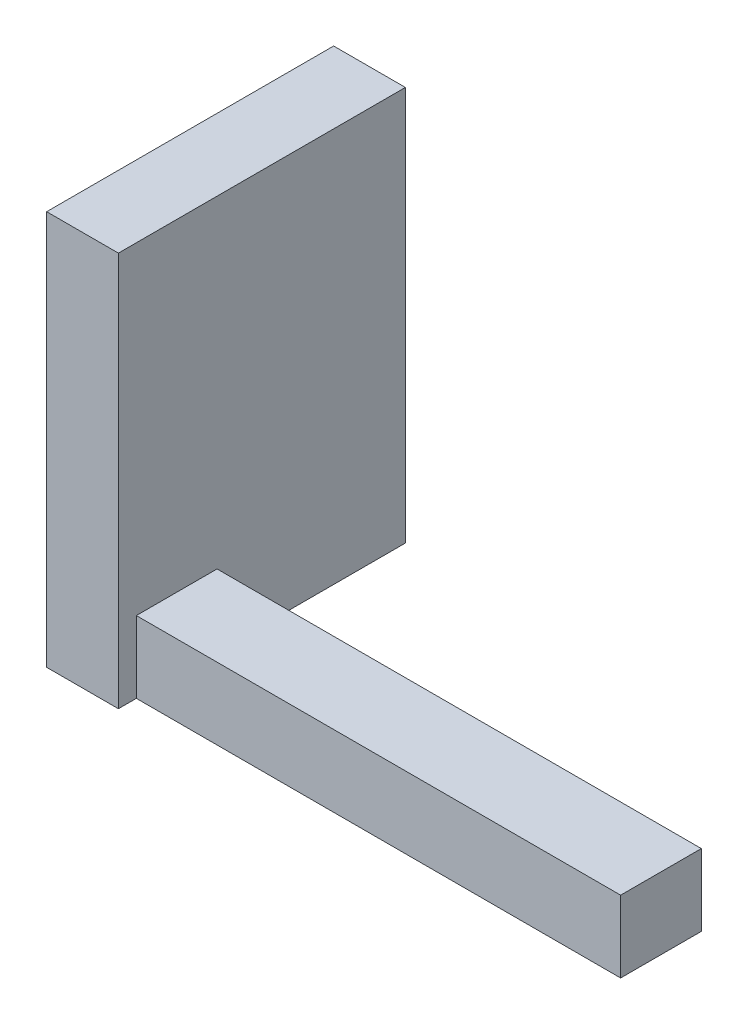
ISO-10303-21;
HEADER;
FILE_DESCRIPTION(('STEP AP214'),'2;1');
FILE_NAME('part.step','',(''),(''),'','','');
FILE_SCHEMA(('AUTOMOTIVE_DESIGN { 1 0 10303 214 1 1 1 1 }'));
ENDSEC;
DATA;
#1=APPLICATION_CONTEXT('core data for automotive mechanical design processes');
#2=APPLICATION_PROTOCOL_DEFINITION('international standard','automotive_design',2000,#1);
#3=PRODUCT_CONTEXT('',#1,'mechanical');
#4=PRODUCT('Part','Part','',(#3));
#5=PRODUCT_RELATED_PRODUCT_CATEGORY('part','',(#4));
#6=PRODUCT_DEFINITION_FORMATION('','',#4);
#7=PRODUCT_DEFINITION_CONTEXT('part definition',#1,'design');
#8=PRODUCT_DEFINITION('design','',#6,#7);
#9=PRODUCT_DEFINITION_SHAPE('','',#8);
#10=(LENGTH_UNIT() NAMED_UNIT(*) SI_UNIT(.MILLI.,.METRE.));
#11=(NAMED_UNIT(*) PLANE_ANGLE_UNIT() SI_UNIT($,.RADIAN.));
#12=(NAMED_UNIT(*) SI_UNIT($,.STERADIAN.) SOLID_ANGLE_UNIT());
#13=UNCERTAINTY_MEASURE_WITH_UNIT(LENGTH_MEASURE(1.E-05),#10,'distance_accuracy_value','');
#14=(GEOMETRIC_REPRESENTATION_CONTEXT(3) GLOBAL_UNCERTAINTY_ASSIGNED_CONTEXT((#13)) GLOBAL_UNIT_ASSIGNED_CONTEXT((#10,
#11,#12)) REPRESENTATION_CONTEXT('',''));
#15=CARTESIAN_POINT('',(0.,0.,0.));
#16=DIRECTION('',(0.,0.,1.));
#17=DIRECTION('',(1.,0.,0.));
#18=AXIS2_PLACEMENT_3D('',#15,#16,#17);
#19=CARTESIAN_POINT('',(77.,66.,39.));
#20=DIRECTION('',(0.,0.,-1.));
#21=DIRECTION('',(-1.,0.,0.));
#22=AXIS2_PLACEMENT_3D('',#19,#20,#21);
#23=PLANE('',#22);
#24=DIRECTION('',(0.,-1.,0.));
#25=VECTOR('',#24,1.);
#26=CARTESIAN_POINT('',(46.,66.,39.));
#27=LINE('',#26,#25);
#28=CARTESIAN_POINT('',(46.,70.,39.));
#29=VERTEX_POINT('',#28);
#30=CARTESIAN_POINT('',(46.,66.,39.));
#31=VERTEX_POINT('',#30);
#32=EDGE_CURVE('E112',#29,#31,#27,.T.);
#33=ORIENTED_EDGE('',*,*,#32,.T.);
#34=DIRECTION('',(-1.,0.,0.));
#35=VECTOR('',#34,1.);
#36=CARTESIAN_POINT('',(77.,66.,39.));
#37=LINE('',#36,#35);
#38=CARTESIAN_POINT('',(77.,66.,39.));
#39=VERTEX_POINT('',#38);
#40=EDGE_CURVE('E12',#39,#31,#37,.T.);
#41=ORIENTED_EDGE('',*,*,#40,.F.);
#42=DIRECTION('',(0.,-1.,0.));
#43=VECTOR('',#42,1.);
#44=CARTESIAN_POINT('',(77.,66.,39.));
#45=LINE('',#44,#43);
#46=CARTESIAN_POINT('',(77.,70.,39.));
#47=VERTEX_POINT('',#46);
#48=EDGE_CURVE('E100',#47,#39,#45,.T.);
#49=ORIENTED_EDGE('',*,*,#48,.F.);
#50=DIRECTION('',(-1.,0.,0.));
#51=VECTOR('',#50,1.);
#52=CARTESIAN_POINT('',(77.,70.,39.));
#53=LINE('',#52,#51);
#54=EDGE_CURVE('E108',#47,#29,#53,.T.);
#55=ORIENTED_EDGE('',*,*,#54,.T.);
#56=EDGE_LOOP('',(#33,#41,#49,#55));
#57=FACE_BOUND('',#56,.T.);
#58=ADVANCED_FACE('F49',(#57),#23,.F.);
#59=CARTESIAN_POINT('',(77.,66.,34.5));
#60=DIRECTION('',(0.,1.,0.));
#61=DIRECTION('',(0.,0.,1.));
#62=AXIS2_PLACEMENT_3D('',#59,#60,#61);
#63=PLANE('',#62);
#64=DIRECTION('',(0.,0.,-1.));
#65=VECTOR('',#64,1.);
#66=CARTESIAN_POINT('',(46.,66.,34.5));
#67=LINE('',#66,#65);
#68=CARTESIAN_POINT('',(46.,66.,34.5));
#69=VERTEX_POINT('',#68);
#70=EDGE_CURVE('E104',#31,#69,#67,.T.);
#71=ORIENTED_EDGE('',*,*,#70,.T.);
#72=DIRECTION('',(-1.,0.,0.));
#73=VECTOR('',#72,1.);
#74=CARTESIAN_POINT('',(77.,66.,34.5));
#75=LINE('',#74,#73);
#76=CARTESIAN_POINT('',(77.,66.,34.5));
#77=VERTEX_POINT('',#76);
#78=EDGE_CURVE('E57',#77,#69,#75,.T.);
#79=ORIENTED_EDGE('',*,*,#78,.F.);
#80=DIRECTION('',(0.,0.,-1.));
#81=VECTOR('',#80,1.);
#82=CARTESIAN_POINT('',(77.,66.,34.5));
#83=LINE('',#82,#81);
#84=EDGE_CURVE('E95',#39,#77,#83,.T.);
#85=ORIENTED_EDGE('',*,*,#84,.F.);
#86=ORIENTED_EDGE('',*,*,#40,.T.);
#87=EDGE_LOOP('',(#71,#79,#85,#86));
#88=FACE_BOUND('',#87,.T.);
#89=ADVANCED_FACE('F103',(#88),#63,.F.);
#90=CARTESIAN_POINT('',(77.,66.,34.5));
#91=DIRECTION('',(0.,0.,1.));
#92=DIRECTION('',(1.,0.,0.));
#93=AXIS2_PLACEMENT_3D('',#90,#91,#92);
#94=PLANE('',#93);
#95=DIRECTION('',(0.,1.,0.));
#96=VECTOR('',#95,1.);
#97=CARTESIAN_POINT('',(46.,66.,34.5));
#98=LINE('',#97,#96);
#99=CARTESIAN_POINT('',(46.,70.,34.5));
#100=VERTEX_POINT('',#99);
#101=EDGE_CURVE('E82',#69,#100,#98,.T.);
#102=ORIENTED_EDGE('',*,*,#101,.T.);
#103=DIRECTION('',(-1.,0.,0.));
#104=VECTOR('',#103,1.);
#105=CARTESIAN_POINT('',(77.,70.,34.5));
#106=LINE('',#105,#104);
#107=CARTESIAN_POINT('',(77.,70.,34.5));
#108=VERTEX_POINT('',#107);
#109=EDGE_CURVE('E105',#108,#100,#106,.T.);
#110=ORIENTED_EDGE('',*,*,#109,.F.);
#111=DIRECTION('',(0.,1.,0.));
#112=VECTOR('',#111,1.);
#113=CARTESIAN_POINT('',(77.,66.,34.5));
#114=LINE('',#113,#112);
#115=EDGE_CURVE('E98',#77,#108,#114,.T.);
#116=ORIENTED_EDGE('',*,*,#115,.F.);
#117=ORIENTED_EDGE('',*,*,#78,.T.);
#118=EDGE_LOOP('',(#102,#110,#116,#117));
#119=FACE_BOUND('',#118,.T.);
#120=ADVANCED_FACE('F106',(#119),#94,.F.);
#121=CARTESIAN_POINT('',(77.,70.,34.5));
#122=DIRECTION('',(0.,-1.,0.));
#123=DIRECTION('',(0.,0.,-1.));
#124=AXIS2_PLACEMENT_3D('',#121,#122,#123);
#125=PLANE('',#124);
#126=DIRECTION('',(0.,0.,1.));
#127=VECTOR('',#126,1.);
#128=CARTESIAN_POINT('',(46.,70.,34.5));
#129=LINE('',#128,#127);
#130=EDGE_CURVE('E88',#100,#29,#129,.T.);
#131=ORIENTED_EDGE('',*,*,#130,.T.);
#132=ORIENTED_EDGE('',*,*,#54,.F.);
#133=DIRECTION('',(0.,0.,1.));
#134=VECTOR('',#133,1.);
#135=CARTESIAN_POINT('',(77.,70.,34.5));
#136=LINE('',#135,#134);
#137=EDGE_CURVE('E65',#108,#47,#136,.T.);
#138=ORIENTED_EDGE('',*,*,#137,.F.);
#139=ORIENTED_EDGE('',*,*,#109,.T.);
#140=EDGE_LOOP('',(#131,#132,#138,#139));
#141=FACE_BOUND('',#140,.T.);
#142=ADVANCED_FACE('F119',(#141),#125,.F.);
#143=CARTESIAN_POINT('',(77.,0.,0.));
#144=DIRECTION('',(1.,0.,0.));
#145=DIRECTION('',(0.,0.,-1.));
#146=AXIS2_PLACEMENT_3D('',#143,#144,#145);
#147=PLANE('',#146);
#148=ORIENTED_EDGE('',*,*,#48,.T.);
#149=ORIENTED_EDGE('',*,*,#84,.T.);
#150=ORIENTED_EDGE('',*,*,#115,.T.);
#151=ORIENTED_EDGE('',*,*,#137,.T.);
#152=EDGE_LOOP('',(#148,#149,#150,#151));
#153=FACE_BOUND('',#152,.T.);
#154=ADVANCED_FACE('F96',(#153),#147,.T.);
#155=CARTESIAN_POINT('',(46.,0.,0.));
#156=DIRECTION('',(1.,0.,0.));
#157=DIRECTION('',(0.,0.,-1.));
#158=AXIS2_PLACEMENT_3D('',#155,#156,#157);
#159=PLANE('',#158);
#160=ORIENTED_EDGE('',*,*,#32,.F.);
#161=ORIENTED_EDGE('',*,*,#130,.F.);
#162=ORIENTED_EDGE('',*,*,#101,.F.);
#163=ORIENTED_EDGE('',*,*,#70,.F.);
#164=EDGE_LOOP('',(#160,#161,#162,#163));
#165=FACE_BOUND('',#164,.T.);
#166=ADVANCED_FACE('F122',(#165),#159,.F.);
#167=CLOSED_SHELL('',(#58,#89,#120,#142,#154,#166));
#168=MANIFOLD_SOLID_BREP('B2',#167);
#169=CARTESIAN_POINT('',(50.,66.,40.));
#170=DIRECTION('',(0.,0.,-1.));
#171=DIRECTION('',(-1.,0.,0.));
#172=AXIS2_PLACEMENT_3D('',#169,#170,#171);
#173=PLANE('',#172);
#174=DIRECTION('',(0.,-1.,0.));
#175=VECTOR('',#174,1.);
#176=CARTESIAN_POINT('',(46.,66.,40.));
#177=LINE('',#176,#175);
#178=CARTESIAN_POINT('',(46.,88.,40.));
#179=VERTEX_POINT('',#178);
#180=CARTESIAN_POINT('',(46.,66.,40.));
#181=VERTEX_POINT('',#180);
#182=EDGE_CURVE('E236',#179,#181,#177,.T.);
#183=ORIENTED_EDGE('',*,*,#182,.T.);
#184=DIRECTION('',(-1.,0.,0.));
#185=VECTOR('',#184,1.);
#186=CARTESIAN_POINT('',(50.,66.,40.));
#187=LINE('',#186,#185);
#188=CARTESIAN_POINT('',(50.,66.,40.));
#189=VERTEX_POINT('',#188);
#190=EDGE_CURVE('E47',#189,#181,#187,.T.);
#191=ORIENTED_EDGE('',*,*,#190,.F.);
#192=DIRECTION('',(0.,-1.,0.));
#193=VECTOR('',#192,1.);
#194=CARTESIAN_POINT('',(50.,66.,40.));
#195=LINE('',#194,#193);
#196=CARTESIAN_POINT('',(50.,88.,40.));
#197=VERTEX_POINT('',#196);
#198=EDGE_CURVE('E224',#197,#189,#195,.T.);
#199=ORIENTED_EDGE('',*,*,#198,.F.);
#200=DIRECTION('',(-1.,0.,0.));
#201=VECTOR('',#200,1.);
#202=CARTESIAN_POINT('',(50.,88.,40.));
#203=LINE('',#202,#201);
#204=EDGE_CURVE('E232',#197,#179,#203,.T.);
#205=ORIENTED_EDGE('',*,*,#204,.T.);
#206=EDGE_LOOP('',(#183,#191,#199,#205));
#207=FACE_BOUND('',#206,.T.);
#208=ADVANCED_FACE('F173',(#207),#173,.F.);
#209=CARTESIAN_POINT('',(50.,66.,24.));
#210=DIRECTION('',(0.,1.,0.));
#211=DIRECTION('',(0.,0.,1.));
#212=AXIS2_PLACEMENT_3D('',#209,#210,#211);
#213=PLANE('',#212);
#214=DIRECTION('',(0.,0.,-1.));
#215=VECTOR('',#214,1.);
#216=CARTESIAN_POINT('',(46.,66.,24.));
#217=LINE('',#216,#215);
#218=CARTESIAN_POINT('',(46.,66.,24.));
#219=VERTEX_POINT('',#218);
#220=EDGE_CURVE('E228',#181,#219,#217,.T.);
#221=ORIENTED_EDGE('',*,*,#220,.T.);
#222=DIRECTION('',(-1.,0.,0.));
#223=VECTOR('',#222,1.);
#224=CARTESIAN_POINT('',(50.,66.,24.));
#225=LINE('',#224,#223);
#226=CARTESIAN_POINT('',(50.,66.,24.));
#227=VERTEX_POINT('',#226);
#228=EDGE_CURVE('E181',#227,#219,#225,.T.);
#229=ORIENTED_EDGE('',*,*,#228,.F.);
#230=DIRECTION('',(0.,0.,-1.));
#231=VECTOR('',#230,1.);
#232=CARTESIAN_POINT('',(50.,66.,24.));
#233=LINE('',#232,#231);
#234=EDGE_CURVE('E219',#189,#227,#233,.T.);
#235=ORIENTED_EDGE('',*,*,#234,.F.);
#236=ORIENTED_EDGE('',*,*,#190,.T.);
#237=EDGE_LOOP('',(#221,#229,#235,#236));
#238=FACE_BOUND('',#237,.T.);
#239=ADVANCED_FACE('F227',(#238),#213,.F.);
#240=CARTESIAN_POINT('',(50.,66.,24.));
#241=DIRECTION('',(0.,0.,1.));
#242=DIRECTION('',(1.,0.,0.));
#243=AXIS2_PLACEMENT_3D('',#240,#241,#242);
#244=PLANE('',#243);
#245=DIRECTION('',(0.,1.,0.));
#246=VECTOR('',#245,1.);
#247=CARTESIAN_POINT('',(46.,66.,24.));
#248=LINE('',#247,#246);
#249=CARTESIAN_POINT('',(46.,88.,24.));
#250=VERTEX_POINT('',#249);
#251=EDGE_CURVE('E206',#219,#250,#248,.T.);
#252=ORIENTED_EDGE('',*,*,#251,.T.);
#253=DIRECTION('',(-1.,0.,0.));
#254=VECTOR('',#253,1.);
#255=CARTESIAN_POINT('',(50.,88.,24.));
#256=LINE('',#255,#254);
#257=CARTESIAN_POINT('',(50.,88.,24.));
#258=VERTEX_POINT('',#257);
#259=EDGE_CURVE('E229',#258,#250,#256,.T.);
#260=ORIENTED_EDGE('',*,*,#259,.F.);
#261=DIRECTION('',(0.,1.,0.));
#262=VECTOR('',#261,1.);
#263=CARTESIAN_POINT('',(50.,66.,24.));
#264=LINE('',#263,#262);
#265=EDGE_CURVE('E222',#227,#258,#264,.T.);
#266=ORIENTED_EDGE('',*,*,#265,.F.);
#267=ORIENTED_EDGE('',*,*,#228,.T.);
#268=EDGE_LOOP('',(#252,#260,#266,#267));
#269=FACE_BOUND('',#268,.T.);
#270=ADVANCED_FACE('F230',(#269),#244,.F.);
#271=CARTESIAN_POINT('',(50.,88.,24.));
#272=DIRECTION('',(0.,-1.,0.));
#273=DIRECTION('',(0.,0.,-1.));
#274=AXIS2_PLACEMENT_3D('',#271,#272,#273);
#275=PLANE('',#274);
#276=DIRECTION('',(0.,0.,1.));
#277=VECTOR('',#276,1.);
#278=CARTESIAN_POINT('',(46.,88.,24.));
#279=LINE('',#278,#277);
#280=EDGE_CURVE('E212',#250,#179,#279,.T.);
#281=ORIENTED_EDGE('',*,*,#280,.T.);
#282=ORIENTED_EDGE('',*,*,#204,.F.);
#283=DIRECTION('',(0.,0.,1.));
#284=VECTOR('',#283,1.);
#285=CARTESIAN_POINT('',(50.,88.,24.));
#286=LINE('',#285,#284);
#287=EDGE_CURVE('E189',#258,#197,#286,.T.);
#288=ORIENTED_EDGE('',*,*,#287,.F.);
#289=ORIENTED_EDGE('',*,*,#259,.T.);
#290=EDGE_LOOP('',(#281,#282,#288,#289));
#291=FACE_BOUND('',#290,.T.);
#292=ADVANCED_FACE('F243',(#291),#275,.F.);
#293=CARTESIAN_POINT('',(50.,0.,0.));
#294=DIRECTION('',(1.,0.,0.));
#295=DIRECTION('',(0.,0.,-1.));
#296=AXIS2_PLACEMENT_3D('',#293,#294,#295);
#297=PLANE('',#296);
#298=ORIENTED_EDGE('',*,*,#198,.T.);
#299=ORIENTED_EDGE('',*,*,#234,.T.);
#300=ORIENTED_EDGE('',*,*,#265,.T.);
#301=ORIENTED_EDGE('',*,*,#287,.T.);
#302=EDGE_LOOP('',(#298,#299,#300,#301));
#303=FACE_BOUND('',#302,.T.);
#304=ADVANCED_FACE('F220',(#303),#297,.T.);
#305=CARTESIAN_POINT('',(46.,0.,0.));
#306=DIRECTION('',(1.,0.,0.));
#307=DIRECTION('',(0.,0.,-1.));
#308=AXIS2_PLACEMENT_3D('',#305,#306,#307);
#309=PLANE('',#308);
#310=ORIENTED_EDGE('',*,*,#182,.F.);
#311=ORIENTED_EDGE('',*,*,#280,.F.);
#312=ORIENTED_EDGE('',*,*,#251,.F.);
#313=ORIENTED_EDGE('',*,*,#220,.F.);
#314=EDGE_LOOP('',(#310,#311,#312,#313));
#315=FACE_BOUND('',#314,.T.);
#316=ADVANCED_FACE('F246',(#315),#309,.F.);
#317=CLOSED_SHELL('',(#208,#239,#270,#292,#304,#316));
#318=MANIFOLD_SOLID_BREP('B6',#317);
#319=ADVANCED_BREP_SHAPE_REPRESENTATION('',(#18,#168,#318),#14);
#320=SHAPE_DEFINITION_REPRESENTATION(#9,#319);
ENDSEC;
END-ISO-10303-21;
